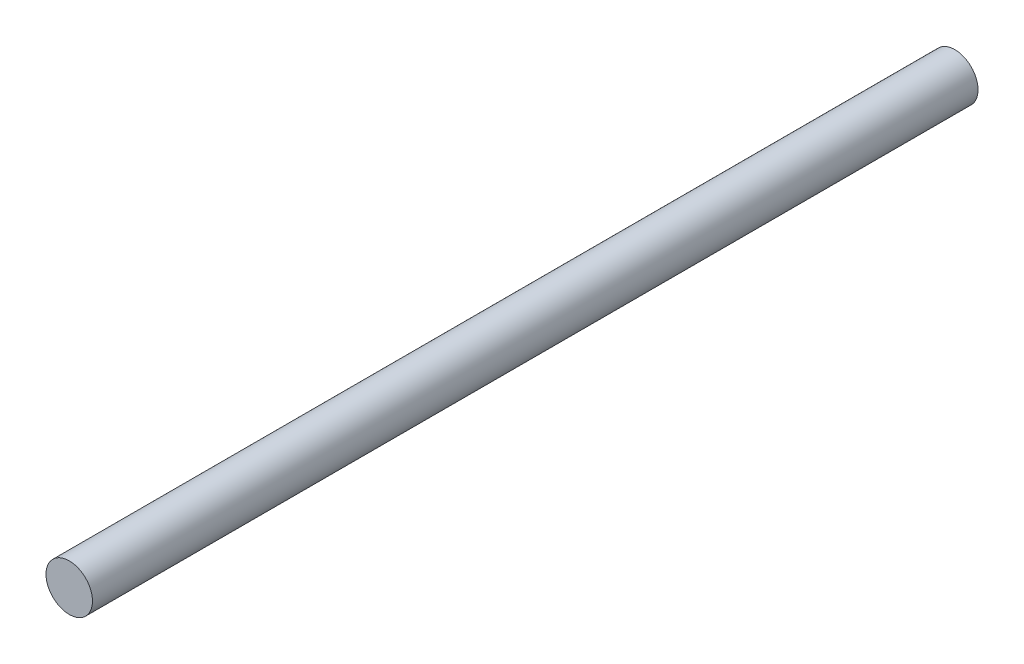
ISO-10303-21;
HEADER;
FILE_DESCRIPTION(('STEP AP214'),'2;1');
FILE_NAME('part.step','',(''),(''),'','','');
FILE_SCHEMA(('AUTOMOTIVE_DESIGN { 1 0 10303 214 1 1 1 1 }'));
ENDSEC;
DATA;
#1=APPLICATION_CONTEXT('core data for automotive mechanical design processes');
#2=APPLICATION_PROTOCOL_DEFINITION('international standard','automotive_design',2000,#1);
#3=PRODUCT_CONTEXT('',#1,'mechanical');
#4=PRODUCT('Part','Part','',(#3));
#5=PRODUCT_RELATED_PRODUCT_CATEGORY('part','',(#4));
#6=PRODUCT_DEFINITION_FORMATION('','',#4);
#7=PRODUCT_DEFINITION_CONTEXT('part definition',#1,'design');
#8=PRODUCT_DEFINITION('design','',#6,#7);
#9=PRODUCT_DEFINITION_SHAPE('','',#8);
#10=(LENGTH_UNIT() NAMED_UNIT(*) SI_UNIT(.MILLI.,.METRE.));
#11=(NAMED_UNIT(*) PLANE_ANGLE_UNIT() SI_UNIT($,.RADIAN.));
#12=(NAMED_UNIT(*) SI_UNIT($,.STERADIAN.) SOLID_ANGLE_UNIT());
#13=UNCERTAINTY_MEASURE_WITH_UNIT(LENGTH_MEASURE(1.E-05),#10,'distance_accuracy_value','');
#14=(GEOMETRIC_REPRESENTATION_CONTEXT(3) GLOBAL_UNCERTAINTY_ASSIGNED_CONTEXT((#13)) GLOBAL_UNIT_ASSIGNED_CONTEXT((#10,
#11,#12)) REPRESENTATION_CONTEXT('',''));
#15=CARTESIAN_POINT('',(0.,0.,0.));
#16=DIRECTION('',(0.,0.,1.));
#17=DIRECTION('',(1.,0.,0.));
#18=AXIS2_PLACEMENT_3D('',#15,#16,#17);
#19=CARTESIAN_POINT('',(0.,0.,38.1));
#20=DIRECTION('',(0.,0.,-1.));
#21=DIRECTION('',(-1.,0.,0.));
#22=AXIS2_PLACEMENT_3D('',#19,#20,#21);
#23=CYLINDRICAL_SURFACE('',#22,2.);
#24=CARTESIAN_POINT('',(0.,0.,38.1));
#25=DIRECTION('',(0.,0.,1.));
#26=DIRECTION('',(1.,0.,0.));
#27=AXIS2_PLACEMENT_3D('',#24,#25,#26);
#28=CIRCLE('',#27,2.);
#29=CARTESIAN_POINT('',(-2.,0.,38.1));
#30=VERTEX_POINT('',#29);
#31=EDGE_CURVE('E10',#30,#30,#28,.T.);
#32=CARTESIAN_POINT('',(0.,0.,-38.1));
#33=DIRECTION('',(0.,0.,1.));
#34=DIRECTION('',(1.,0.,0.));
#35=AXIS2_PLACEMENT_3D('',#32,#33,#34);
#36=CIRCLE('',#35,2.);
#37=CARTESIAN_POINT('',(-2.,0.,-38.1));
#38=VERTEX_POINT('',#37);
#39=EDGE_CURVE('E35',#38,#38,#36,.T.);
#40=CARTESIAN_POINT('',(-2.,0.,38.1));
#41=CARTESIAN_POINT('',(-2.,0.,37.30625));
#42=CARTESIAN_POINT('',(-2.,0.,36.5125));
#43=CARTESIAN_POINT('',(-2.,0.,34.925));
#44=CARTESIAN_POINT('',(-2.,0.,34.13125));
#45=CARTESIAN_POINT('',(-2.,0.,32.54375));
#46=CARTESIAN_POINT('',(-2.,0.,31.75));
#47=CARTESIAN_POINT('',(-2.,0.,30.1625));
#48=CARTESIAN_POINT('',(-2.,0.,29.36875));
#49=CARTESIAN_POINT('',(-2.,0.,27.78125));
#50=CARTESIAN_POINT('',(-2.,0.,26.9875));
#51=CARTESIAN_POINT('',(-2.,0.,25.4));
#52=CARTESIAN_POINT('',(-2.,0.,24.60625));
#53=CARTESIAN_POINT('',(-2.,0.,23.01875));
#54=CARTESIAN_POINT('',(-2.,0.,22.225));
#55=CARTESIAN_POINT('',(-2.,0.,20.6375));
#56=CARTESIAN_POINT('',(-2.,0.,19.84375));
#57=CARTESIAN_POINT('',(-2.,0.,18.25625));
#58=CARTESIAN_POINT('',(-2.,0.,17.4625));
#59=CARTESIAN_POINT('',(-2.,0.,15.875));
#60=CARTESIAN_POINT('',(-2.,0.,15.08125));
#61=CARTESIAN_POINT('',(-2.,0.,13.49375));
#62=CARTESIAN_POINT('',(-2.,0.,12.7));
#63=CARTESIAN_POINT('',(-2.,0.,11.1125));
#64=CARTESIAN_POINT('',(-2.,0.,10.31875));
#65=CARTESIAN_POINT('',(-2.,0.,8.73124999999999));
#66=CARTESIAN_POINT('',(-2.,0.,7.93749999999999));
#67=CARTESIAN_POINT('',(-2.,0.,6.34999999999999));
#68=CARTESIAN_POINT('',(-2.,0.,5.55625));
#69=CARTESIAN_POINT('',(-2.,0.,3.96875));
#70=CARTESIAN_POINT('',(-2.,0.,3.17499999999999));
#71=CARTESIAN_POINT('',(-2.,0.,1.58749999999999));
#72=CARTESIAN_POINT('',(-2.,0.,0.793749999999994));
#73=CARTESIAN_POINT('',(-2.,0.,-0.793750000000007));
#74=CARTESIAN_POINT('',(-2.,0.,-1.58750000000001));
#75=CARTESIAN_POINT('',(-2.,0.,-3.17500000000001));
#76=CARTESIAN_POINT('',(-2.,0.,-3.96875000000001));
#77=CARTESIAN_POINT('',(-2.,0.,-5.55625000000001));
#78=CARTESIAN_POINT('',(-2.,0.,-6.35000000000001));
#79=CARTESIAN_POINT('',(-2.,0.,-7.93750000000001));
#80=CARTESIAN_POINT('',(-2.,0.,-8.73125000000001));
#81=CARTESIAN_POINT('',(-2.,0.,-10.31875));
#82=CARTESIAN_POINT('',(-2.,0.,-11.1125));
#83=CARTESIAN_POINT('',(-2.,0.,-12.7));
#84=CARTESIAN_POINT('',(-2.,0.,-13.49375));
#85=CARTESIAN_POINT('',(-2.,0.,-15.08125));
#86=CARTESIAN_POINT('',(-2.,0.,-15.875));
#87=CARTESIAN_POINT('',(-2.,0.,-17.4625));
#88=CARTESIAN_POINT('',(-2.,0.,-18.25625));
#89=CARTESIAN_POINT('',(-2.,0.,-19.84375));
#90=CARTESIAN_POINT('',(-2.,0.,-20.6375));
#91=CARTESIAN_POINT('',(-2.,0.,-22.225));
#92=CARTESIAN_POINT('',(-2.,0.,-23.01875));
#93=CARTESIAN_POINT('',(-2.,0.,-24.60625));
#94=CARTESIAN_POINT('',(-2.,0.,-25.4));
#95=CARTESIAN_POINT('',(-2.,0.,-26.9875));
#96=CARTESIAN_POINT('',(-2.,0.,-27.78125));
#97=CARTESIAN_POINT('',(-2.,0.,-29.36875));
#98=CARTESIAN_POINT('',(-2.,0.,-30.1625));
#99=CARTESIAN_POINT('',(-2.,0.,-31.75));
#100=CARTESIAN_POINT('',(-2.,0.,-32.54375));
#101=CARTESIAN_POINT('',(-2.,0.,-34.13125));
#102=CARTESIAN_POINT('',(-2.,0.,-34.925));
#103=CARTESIAN_POINT('',(-2.,0.,-36.5125));
#104=CARTESIAN_POINT('',(-2.,0.,-37.30625));
#105=CARTESIAN_POINT('',(-2.,0.,-38.1));
#106=B_SPLINE_CURVE_WITH_KNOTS('',3,(#40,#41,#42,#43,#44,#45,#46,#47,#48,#49,#50,#51,#52,#53,
#54,#55,#56,#57,#58,#59,#60,#61,#62,#63,#64,#65,#66,#67,#68,#69,#70,#71,#72,#73,#74,#75,#76,#77,
#78,#79,#80,#81,#82,#83,#84,#85,#86,#87,#88,#89,#90,#91,#92,#93,#94,#95,#96,#97,#98,#99,#100,
#101,#102,#103,#104,#105),.UNSPECIFIED.,.F.,.F.,(4,2,2,2,2,2,2,2,2,2,2,2,2,2,2,2,2,2,2,2,2,2,2,
2,2,2,2,2,2,2,2,2,4),(0.,2.38124999999999,4.7625,7.14375,9.525,11.90625,14.2875,16.66875,19.05,
21.43125,23.8125,26.19375,28.575,30.95625,33.3375,35.71875,38.1,40.48125,42.8625,45.24375,
47.625,50.00625,52.3875,54.76875,57.15,59.53125,61.9125,64.29375,66.675,69.05625,71.4375,
73.81875,76.2),.UNSPECIFIED.);
#107=EDGE_CURVE('BSEAM32',#30,#38,#106,.T.);
#108=ORIENTED_EDGE('',*,*,#31,.F.);
#109=ORIENTED_EDGE('',*,*,#39,.T.);
#110=ORIENTED_EDGE('',*,*,#107,.T.);
#111=ORIENTED_EDGE('',*,*,#107,.F.);
#112=EDGE_LOOP('',(#108,#110,#109,#111));
#113=FACE_BOUND('',#112,.T.);
#114=ADVANCED_FACE('F32',(#113),#23,.T.);
#115=CARTESIAN_POINT('',(0.,0.,38.1));
#116=DIRECTION('',(0.,0.,1.));
#117=DIRECTION('',(1.,0.,0.));
#118=AXIS2_PLACEMENT_3D('',#115,#116,#117);
#119=PLANE('',#118);
#120=ORIENTED_EDGE('',*,*,#31,.T.);
#121=EDGE_LOOP('',(#120));
#122=FACE_BOUND('',#121,.T.);
#123=ADVANCED_FACE('F47',(#122),#119,.T.);
#124=CARTESIAN_POINT('',(0.,0.,-38.1));
#125=DIRECTION('',(0.,0.,1.));
#126=DIRECTION('',(1.,0.,0.));
#127=AXIS2_PLACEMENT_3D('',#124,#125,#126);
#128=PLANE('',#127);
#129=ORIENTED_EDGE('',*,*,#39,.F.);
#130=EDGE_LOOP('',(#129));
#131=FACE_BOUND('',#130,.T.);
#132=ADVANCED_FACE('F45',(#131),#128,.F.);
#133=CLOSED_SHELL('',(#114,#123,#132));
#134=MANIFOLD_SOLID_BREP('B2',#133);
#135=ADVANCED_BREP_SHAPE_REPRESENTATION('',(#18,#134),#14);
#136=SHAPE_DEFINITION_REPRESENTATION(#9,#135);
ENDSEC;
END-ISO-10303-21;
